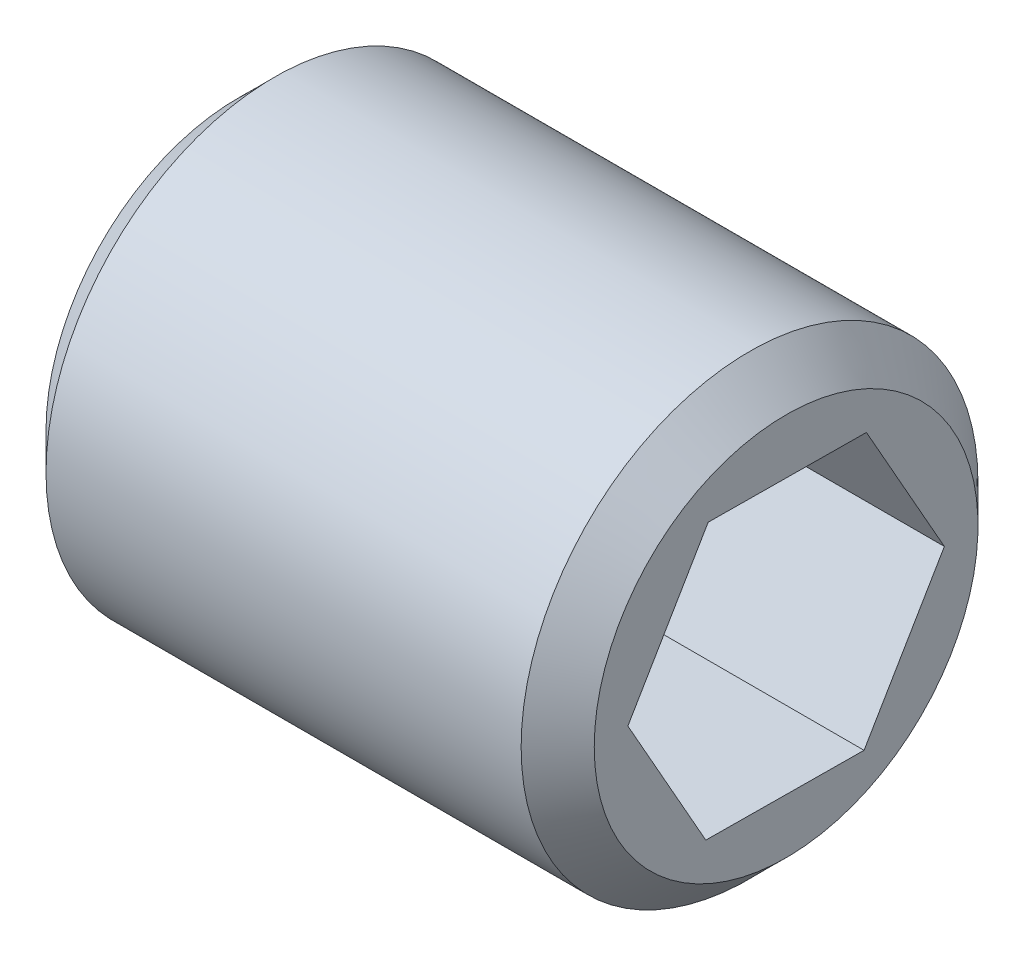
ISO-10303-21;
HEADER;
FILE_DESCRIPTION(('STEP AP214'),'2;1');
FILE_NAME('part.step','',(''),(''),'','','');
FILE_SCHEMA(('AUTOMOTIVE_DESIGN { 1 0 10303 214 1 1 1 1 }'));
ENDSEC;
DATA;
#1=APPLICATION_CONTEXT('core data for automotive mechanical design processes');
#2=APPLICATION_PROTOCOL_DEFINITION('international standard','automotive_design',2000,#1);
#3=PRODUCT_CONTEXT('',#1,'mechanical');
#4=PRODUCT('Part','Part','',(#3));
#5=PRODUCT_RELATED_PRODUCT_CATEGORY('part','',(#4));
#6=PRODUCT_DEFINITION_FORMATION('','',#4);
#7=PRODUCT_DEFINITION_CONTEXT('part definition',#1,'design');
#8=PRODUCT_DEFINITION('design','',#6,#7);
#9=PRODUCT_DEFINITION_SHAPE('','',#8);
#10=(LENGTH_UNIT() NAMED_UNIT(*) SI_UNIT(.MILLI.,.METRE.));
#11=(NAMED_UNIT(*) PLANE_ANGLE_UNIT() SI_UNIT($,.RADIAN.));
#12=(NAMED_UNIT(*) SI_UNIT($,.STERADIAN.) SOLID_ANGLE_UNIT());
#13=UNCERTAINTY_MEASURE_WITH_UNIT(LENGTH_MEASURE(1.E-05),#10,'distance_accuracy_value','');
#14=(GEOMETRIC_REPRESENTATION_CONTEXT(3) GLOBAL_UNCERTAINTY_ASSIGNED_CONTEXT((#13)) GLOBAL_UNIT_ASSIGNED_CONTEXT((#10,
#11,#12)) REPRESENTATION_CONTEXT('',''));
#15=CARTESIAN_POINT('',(0.,0.,0.));
#16=DIRECTION('',(0.,0.,1.));
#17=DIRECTION('',(1.,0.,0.));
#18=AXIS2_PLACEMENT_3D('',#15,#16,#17);
#19=CARTESIAN_POINT('',(-3.,0.,0.));
#20=DIRECTION('',(1.,0.,0.));
#21=DIRECTION('',(0.,0.,-1.));
#22=AXIS2_PLACEMENT_3D('',#19,#20,#21);
#23=PLANE('',#22);
#24=CARTESIAN_POINT('',(-3.,0.,0.));
#25=DIRECTION('',(-1.,0.,0.));
#26=DIRECTION('',(0.,0.,1.));
#27=AXIS2_PLACEMENT_3D('',#24,#25,#26);
#28=CIRCLE('',#27,1.05);
#29=CARTESIAN_POINT('',(-3.,0.,1.05));
#30=VERTEX_POINT('',#29);
#31=EDGE_CURVE('E11',#30,#30,#28,.T.);
#32=ORIENTED_EDGE('',*,*,#31,.T.);
#33=EDGE_LOOP('',(#32));
#34=FACE_BOUND('',#33,.T.);
#35=ADVANCED_FACE('F34',(#34),#23,.F.);
#36=CARTESIAN_POINT('',(-2.8,0.,0.));
#37=DIRECTION('',(1.,0.,0.));
#38=DIRECTION('',(0.,0.,-1.));
#39=AXIS2_PLACEMENT_3D('',#36,#37,#38);
#40=CONICAL_SURFACE('',#39,1.25,0.785398163397434);
#41=ORIENTED_EDGE('',*,*,#31,.F.);
#42=EDGE_LOOP('',(#41));
#43=FACE_BOUND('',#42,.T.);
#44=CARTESIAN_POINT('',(-2.8,0.,0.));
#45=DIRECTION('',(-1.,0.,0.));
#46=DIRECTION('',(0.,0.,1.));
#47=AXIS2_PLACEMENT_3D('',#44,#45,#46);
#48=CIRCLE('',#47,1.25);
#49=CARTESIAN_POINT('',(-2.8,0.,1.25));
#50=VERTEX_POINT('',#49);
#51=EDGE_CURVE('E41',#50,#50,#48,.T.);
#52=ORIENTED_EDGE('',*,*,#51,.T.);
#53=EDGE_LOOP('',(#52));
#54=FACE_BOUND('',#53,.T.);
#55=ADVANCED_FACE('F148',(#43,#54),#40,.T.);
#56=CARTESIAN_POINT('',(-47.1276450227838,0.,0.));
#57=DIRECTION('',(-1.,0.,0.));
#58=DIRECTION('',(0.,0.,1.));
#59=AXIS2_PLACEMENT_3D('',#56,#57,#58);
#60=CYLINDRICAL_SURFACE('',#59,1.25);
#61=ORIENTED_EDGE('',*,*,#51,.F.);
#62=EDGE_LOOP('',(#61));
#63=FACE_BOUND('',#62,.T.);
#64=CARTESIAN_POINT('',(-0.199999999999999,0.,0.));
#65=DIRECTION('',(-1.,0.,0.));
#66=DIRECTION('',(0.,0.,1.));
#67=AXIS2_PLACEMENT_3D('',#64,#65,#66);
#68=CIRCLE('',#67,1.25);
#69=CARTESIAN_POINT('',(-0.199999999999999,0.,1.25));
#70=VERTEX_POINT('',#69);
#71=EDGE_CURVE('E143',#70,#70,#68,.T.);
#72=ORIENTED_EDGE('',*,*,#71,.T.);
#73=EDGE_LOOP('',(#72));
#74=FACE_BOUND('',#73,.T.);
#75=ADVANCED_FACE('F150',(#63,#74),#60,.T.);
#76=CARTESIAN_POINT('',(0.,0.,0.));
#77=DIRECTION('',(-1.,0.,0.));
#78=DIRECTION('',(0.,0.,1.));
#79=AXIS2_PLACEMENT_3D('',#76,#77,#78);
#80=CONICAL_SURFACE('',#79,1.05,0.785398163397452);
#81=ORIENTED_EDGE('',*,*,#71,.F.);
#82=EDGE_LOOP('',(#81));
#83=FACE_BOUND('',#82,.T.);
#84=CARTESIAN_POINT('',(0.,0.,0.));
#85=DIRECTION('',(-1.,0.,0.));
#86=DIRECTION('',(0.,0.,1.));
#87=AXIS2_PLACEMENT_3D('',#84,#85,#86);
#88=CIRCLE('',#87,1.05);
#89=CARTESIAN_POINT('',(0.,0.,1.05));
#90=VERTEX_POINT('',#89);
#91=EDGE_CURVE('E135',#90,#90,#88,.T.);
#92=ORIENTED_EDGE('',*,*,#91,.T.);
#93=EDGE_LOOP('',(#92));
#94=FACE_BOUND('',#93,.T.);
#95=ADVANCED_FACE('F153',(#83,#94),#80,.T.);
#96=CARTESIAN_POINT('',(0.,1.05,0.));
#97=DIRECTION('',(-1.,0.,0.));
#98=DIRECTION('',(0.,0.,1.));
#99=AXIS2_PLACEMENT_3D('',#96,#97,#98);
#100=PLANE('',#99);
#101=DIRECTION('',(0.,0.0086016331317113,0.999963005269429));
#102=VECTOR('',#101,1.);
#103=CARTESIAN_POINT('',(0.,0.746247637549024,-0.439447907552762));
#104=LINE('',#103,#102);
#105=CARTESIAN_POINT('',(0.,0.746247637549024,-0.439447907552762));
#106=VERTEX_POINT('',#105);
#107=CARTESIAN_POINT('',(0.,0.75369687035512,0.426545457855195));
#108=VERTEX_POINT('',#107);
#109=EDGE_CURVE('E122',#106,#108,#104,.T.);
#110=ORIENTED_EDGE('',*,*,#109,.F.);
#111=DIRECTION('',(0.,0.870294181973813,0.492532269828619));
#112=VECTOR('',#111,1.);
#113=CARTESIAN_POINT('',(0.,-0.00744923280609549,-0.865993365407958));
#114=LINE('',#113,#112);
#115=CARTESIAN_POINT('',(0.,-0.00744923280609549,-0.865993365407958));
#116=VERTEX_POINT('',#115);
#117=EDGE_CURVE('E48',#116,#106,#114,.T.);
#118=ORIENTED_EDGE('',*,*,#117,.F.);
#119=DIRECTION('',(0.,0.861692548842102,-0.50743073544081));
#120=VECTOR('',#119,1.);
#121=CARTESIAN_POINT('',(0.,-0.753696870355119,-0.426545457855196));
#122=LINE('',#121,#120);
#123=CARTESIAN_POINT('',(0.,-0.753696870355119,-0.426545457855196));
#124=VERTEX_POINT('',#123);
#125=EDGE_CURVE('E131',#124,#116,#122,.T.);
#126=ORIENTED_EDGE('',*,*,#125,.F.);
#127=DIRECTION('',(0.,-0.00860163313171105,-0.999963005269429));
#128=VECTOR('',#127,1.);
#129=CARTESIAN_POINT('',(0.,-0.746247637549024,0.439447907552762));
#130=LINE('',#129,#128);
#131=CARTESIAN_POINT('',(0.,-0.746247637549024,0.439447907552762));
#132=VERTEX_POINT('',#131);
#133=EDGE_CURVE('E129',#132,#124,#130,.T.);
#134=ORIENTED_EDGE('',*,*,#133,.F.);
#135=DIRECTION('',(0.,-0.870294181973813,-0.492532269828619));
#136=VECTOR('',#135,1.);
#137=CARTESIAN_POINT('',(0.,0.0074492328060954,0.865993365407958));
#138=LINE('',#137,#136);
#139=CARTESIAN_POINT('',(0.,0.0074492328060954,0.865993365407958));
#140=VERTEX_POINT('',#139);
#141=EDGE_CURVE('E96',#140,#132,#138,.T.);
#142=ORIENTED_EDGE('',*,*,#141,.F.);
#143=DIRECTION('',(0.,-0.861692548842102,0.50743073544081));
#144=VECTOR('',#143,1.);
#145=CARTESIAN_POINT('',(0.,0.75369687035512,0.426545457855195));
#146=LINE('',#145,#144);
#147=EDGE_CURVE('E125',#108,#140,#146,.T.);
#148=ORIENTED_EDGE('',*,*,#147,.F.);
#149=EDGE_LOOP('',(#110,#118,#126,#134,#142,#148));
#150=FACE_BOUND('',#149,.T.);
#151=ORIENTED_EDGE('',*,*,#91,.F.);
#152=EDGE_LOOP('',(#151));
#153=FACE_BOUND('',#152,.T.);
#154=ADVANCED_FACE('F159',(#150,#153),#100,.F.);
#155=CARTESIAN_POINT('',(-1.5,-0.00744923280609549,-0.865993365407958));
#156=DIRECTION('',(0.,0.492532269828619,-0.870294181973813));
#157=DIRECTION('',(0.,0.870294181973813,0.492532269828619));
#158=AXIS2_PLACEMENT_3D('',#155,#156,#157);
#159=PLANE('',#158);
#160=ORIENTED_EDGE('',*,*,#117,.T.);
#161=DIRECTION('',(1.,0.,0.));
#162=VECTOR('',#161,1.);
#163=CARTESIAN_POINT('',(-1.5,0.746247637549024,-0.439447907552762));
#164=LINE('',#163,#162);
#165=CARTESIAN_POINT('',(-1.5,0.746247637549024,-0.439447907552762));
#166=VERTEX_POINT('',#165);
#167=EDGE_CURVE('E78',#166,#106,#164,.T.);
#168=ORIENTED_EDGE('',*,*,#167,.F.);
#169=DIRECTION('',(0.,0.870294181973813,0.492532269828619));
#170=VECTOR('',#169,1.);
#171=CARTESIAN_POINT('',(-1.5,-0.00744923280609549,-0.865993365407958));
#172=LINE('',#171,#170);
#173=CARTESIAN_POINT('',(-1.5,-0.00744923280609549,-0.865993365407958));
#174=VERTEX_POINT('',#173);
#175=EDGE_CURVE('E133',#174,#166,#172,.T.);
#176=ORIENTED_EDGE('',*,*,#175,.F.);
#177=DIRECTION('',(1.,0.,0.));
#178=VECTOR('',#177,1.);
#179=CARTESIAN_POINT('',(-1.5,-0.00744923280609549,-0.865993365407958));
#180=LINE('',#179,#178);
#181=EDGE_CURVE('E56',#174,#116,#180,.T.);
#182=ORIENTED_EDGE('',*,*,#181,.T.);
#183=EDGE_LOOP('',(#160,#168,#176,#182));
#184=FACE_BOUND('',#183,.T.);
#185=ADVANCED_FACE('F164',(#184),#159,.F.);
#186=CARTESIAN_POINT('',(-1.5,-0.753696870355119,-0.426545457855196));
#187=DIRECTION('',(0.,-0.50743073544081,-0.861692548842102));
#188=DIRECTION('',(0.,0.861692548842102,-0.50743073544081));
#189=AXIS2_PLACEMENT_3D('',#186,#187,#188);
#190=PLANE('',#189);
#191=ORIENTED_EDGE('',*,*,#125,.T.);
#192=ORIENTED_EDGE('',*,*,#181,.F.);
#193=DIRECTION('',(0.,0.861692548842102,-0.50743073544081));
#194=VECTOR('',#193,1.);
#195=CARTESIAN_POINT('',(-1.5,-0.753696870355119,-0.426545457855196));
#196=LINE('',#195,#194);
#197=CARTESIAN_POINT('',(-1.5,-0.753696870355119,-0.426545457855196));
#198=VERTEX_POINT('',#197);
#199=EDGE_CURVE('E108',#198,#174,#196,.T.);
#200=ORIENTED_EDGE('',*,*,#199,.F.);
#201=DIRECTION('',(1.,0.,0.));
#202=VECTOR('',#201,1.);
#203=CARTESIAN_POINT('',(-1.5,-0.753696870355119,-0.426545457855196));
#204=LINE('',#203,#202);
#205=EDGE_CURVE('E100',#198,#124,#204,.T.);
#206=ORIENTED_EDGE('',*,*,#205,.T.);
#207=EDGE_LOOP('',(#191,#192,#200,#206));
#208=FACE_BOUND('',#207,.T.);
#209=ADVANCED_FACE('F170',(#208),#190,.F.);
#210=CARTESIAN_POINT('',(-1.5,-0.746247637549024,0.439447907552762));
#211=DIRECTION('',(0.,-0.999963005269429,0.00860163313171105));
#212=DIRECTION('',(0.,-0.00860163313171105,-0.999963005269429));
#213=AXIS2_PLACEMENT_3D('',#210,#211,#212);
#214=PLANE('',#213);
#215=ORIENTED_EDGE('',*,*,#133,.T.);
#216=ORIENTED_EDGE('',*,*,#205,.F.);
#217=DIRECTION('',(0.,-0.00860163313171105,-0.999963005269429));
#218=VECTOR('',#217,1.);
#219=CARTESIAN_POINT('',(-1.5,-0.746247637549024,0.439447907552762));
#220=LINE('',#219,#218);
#221=CARTESIAN_POINT('',(-1.5,-0.746247637549024,0.439447907552762));
#222=VERTEX_POINT('',#221);
#223=EDGE_CURVE('E104',#222,#198,#220,.T.);
#224=ORIENTED_EDGE('',*,*,#223,.F.);
#225=DIRECTION('',(1.,0.,0.));
#226=VECTOR('',#225,1.);
#227=CARTESIAN_POINT('',(-1.5,-0.746247637549024,0.439447907552762));
#228=LINE('',#227,#226);
#229=EDGE_CURVE('E89',#222,#132,#228,.T.);
#230=ORIENTED_EDGE('',*,*,#229,.T.);
#231=EDGE_LOOP('',(#215,#216,#224,#230));
#232=FACE_BOUND('',#231,.T.);
#233=ADVANCED_FACE('F105',(#232),#214,.F.);
#234=CARTESIAN_POINT('',(-1.5,0.0074492328060954,0.865993365407958));
#235=DIRECTION('',(0.,-0.492532269828619,0.870294181973813));
#236=DIRECTION('',(0.,-0.870294181973813,-0.492532269828619));
#237=AXIS2_PLACEMENT_3D('',#234,#235,#236);
#238=PLANE('',#237);
#239=ORIENTED_EDGE('',*,*,#141,.T.);
#240=ORIENTED_EDGE('',*,*,#229,.F.);
#241=DIRECTION('',(0.,-0.870294181973813,-0.492532269828619));
#242=VECTOR('',#241,1.);
#243=CARTESIAN_POINT('',(-1.5,0.0074492328060954,0.865993365407958));
#244=LINE('',#243,#242);
#245=CARTESIAN_POINT('',(-1.5,0.0074492328060954,0.865993365407958));
#246=VERTEX_POINT('',#245);
#247=EDGE_CURVE('E93',#246,#222,#244,.T.);
#248=ORIENTED_EDGE('',*,*,#247,.F.);
#249=DIRECTION('',(1.,0.,0.));
#250=VECTOR('',#249,1.);
#251=CARTESIAN_POINT('',(-1.5,0.0074492328060954,0.865993365407958));
#252=LINE('',#251,#250);
#253=EDGE_CURVE('E101',#246,#140,#252,.T.);
#254=ORIENTED_EDGE('',*,*,#253,.T.);
#255=EDGE_LOOP('',(#239,#240,#248,#254));
#256=FACE_BOUND('',#255,.T.);
#257=ADVANCED_FACE('F91',(#256),#238,.F.);
#258=CARTESIAN_POINT('',(-1.5,0.75369687035512,0.426545457855195));
#259=DIRECTION('',(0.,0.50743073544081,0.861692548842102));
#260=DIRECTION('',(0.,-0.861692548842102,0.50743073544081));
#261=AXIS2_PLACEMENT_3D('',#258,#259,#260);
#262=PLANE('',#261);
#263=ORIENTED_EDGE('',*,*,#147,.T.);
#264=ORIENTED_EDGE('',*,*,#253,.F.);
#265=DIRECTION('',(0.,-0.861692548842102,0.50743073544081));
#266=VECTOR('',#265,1.);
#267=CARTESIAN_POINT('',(-1.5,0.75369687035512,0.426545457855195));
#268=LINE('',#267,#266);
#269=CARTESIAN_POINT('',(-1.5,0.75369687035512,0.426545457855195));
#270=VERTEX_POINT('',#269);
#271=EDGE_CURVE('E114',#270,#246,#268,.T.);
#272=ORIENTED_EDGE('',*,*,#271,.F.);
#273=DIRECTION('',(1.,0.,0.));
#274=VECTOR('',#273,1.);
#275=CARTESIAN_POINT('',(-1.5,0.75369687035512,0.426545457855195));
#276=LINE('',#275,#274);
#277=EDGE_CURVE('E138',#270,#108,#276,.T.);
#278=ORIENTED_EDGE('',*,*,#277,.T.);
#279=EDGE_LOOP('',(#263,#264,#272,#278));
#280=FACE_BOUND('',#279,.T.);
#281=ADVANCED_FACE('F227',(#280),#262,.F.);
#282=CARTESIAN_POINT('',(-1.5,0.746247637549024,-0.439447907552762));
#283=DIRECTION('',(0.,0.999963005269429,-0.0086016331317113));
#284=DIRECTION('',(0.,0.00860163313171131,0.999963005269429));
#285=AXIS2_PLACEMENT_3D('',#282,#283,#284);
#286=PLANE('',#285);
#287=ORIENTED_EDGE('',*,*,#109,.T.);
#288=ORIENTED_EDGE('',*,*,#277,.F.);
#289=DIRECTION('',(0.,0.0086016331317113,0.999963005269429));
#290=VECTOR('',#289,1.);
#291=CARTESIAN_POINT('',(-1.5,0.746247637549024,-0.439447907552762));
#292=LINE('',#291,#290);
#293=EDGE_CURVE('E116',#166,#270,#292,.T.);
#294=ORIENTED_EDGE('',*,*,#293,.F.);
#295=ORIENTED_EDGE('',*,*,#167,.T.);
#296=EDGE_LOOP('',(#287,#288,#294,#295));
#297=FACE_BOUND('',#296,.T.);
#298=ADVANCED_FACE('F236',(#297),#286,.F.);
#299=CARTESIAN_POINT('',(-1.5,0.746247637549024,-0.439447907552762));
#300=DIRECTION('',(1.,0.,0.));
#301=DIRECTION('',(0.,0.,-1.));
#302=AXIS2_PLACEMENT_3D('',#299,#300,#301);
#303=PLANE('',#302);
#304=ORIENTED_EDGE('',*,*,#175,.T.);
#305=ORIENTED_EDGE('',*,*,#293,.T.);
#306=ORIENTED_EDGE('',*,*,#271,.T.);
#307=ORIENTED_EDGE('',*,*,#247,.T.);
#308=ORIENTED_EDGE('',*,*,#223,.T.);
#309=ORIENTED_EDGE('',*,*,#199,.T.);
#310=EDGE_LOOP('',(#304,#305,#306,#307,#308,#309));
#311=FACE_BOUND('',#310,.T.);
#312=ADVANCED_FACE('F111',(#311),#303,.T.);
#313=CLOSED_SHELL('',(#35,#55,#75,#95,#154,#185,#209,#233,#257,#281,#298,#312));
#314=MANIFOLD_SOLID_BREP('B2',#313);
#315=ADVANCED_BREP_SHAPE_REPRESENTATION('',(#18,#314),#14);
#316=SHAPE_DEFINITION_REPRESENTATION(#9,#315);
ENDSEC;
END-ISO-10303-21;
